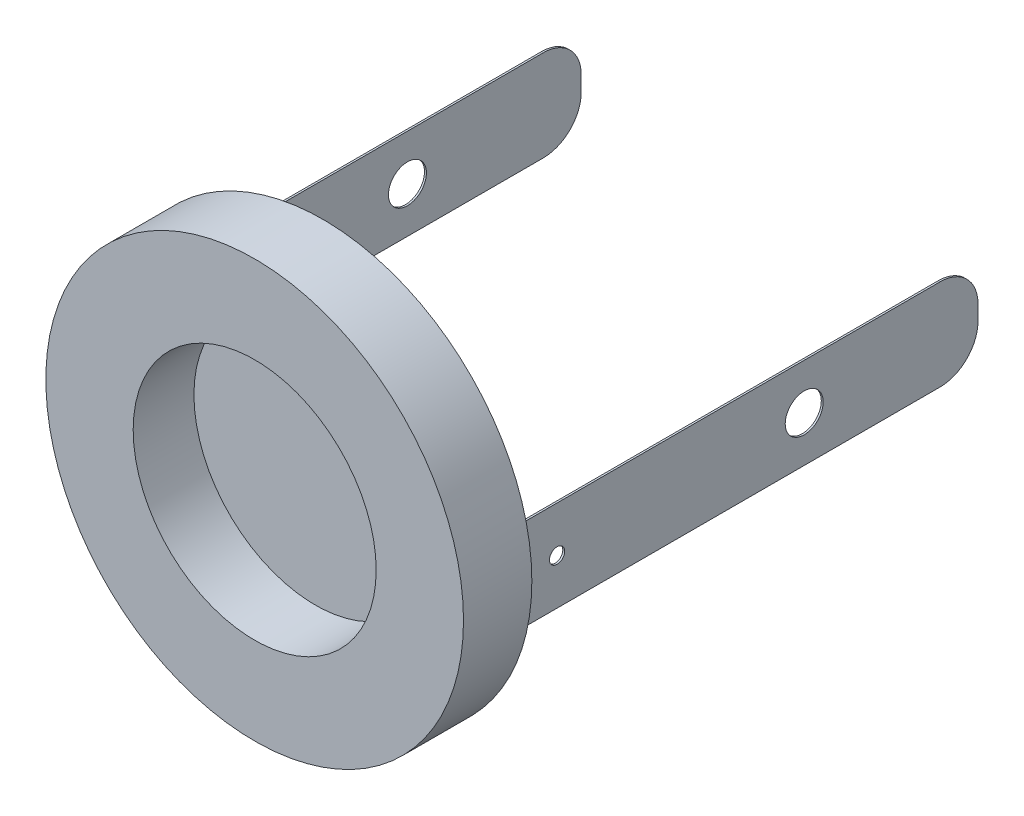
ISO-10303-21;
HEADER;
FILE_DESCRIPTION(('STEP AP214'),'2;1');
FILE_NAME('part.step','',(''),(''),'','','');
FILE_SCHEMA(('AUTOMOTIVE_DESIGN { 1 0 10303 214 1 1 1 1 }'));
ENDSEC;
DATA;
#1=APPLICATION_CONTEXT('core data for automotive mechanical design processes');
#2=APPLICATION_PROTOCOL_DEFINITION('international standard','automotive_design',2000,#1);
#3=PRODUCT_CONTEXT('',#1,'mechanical');
#4=PRODUCT('Part','Part','',(#3));
#5=PRODUCT_RELATED_PRODUCT_CATEGORY('part','',(#4));
#6=PRODUCT_DEFINITION_FORMATION('','',#4);
#7=PRODUCT_DEFINITION_CONTEXT('part definition',#1,'design');
#8=PRODUCT_DEFINITION('design','',#6,#7);
#9=PRODUCT_DEFINITION_SHAPE('','',#8);
#10=(LENGTH_UNIT() NAMED_UNIT(*) SI_UNIT(.MILLI.,.METRE.));
#11=(NAMED_UNIT(*) PLANE_ANGLE_UNIT() SI_UNIT($,.RADIAN.));
#12=(NAMED_UNIT(*) SI_UNIT($,.STERADIAN.) SOLID_ANGLE_UNIT());
#13=UNCERTAINTY_MEASURE_WITH_UNIT(LENGTH_MEASURE(1.E-05),#10,'distance_accuracy_value','');
#14=(GEOMETRIC_REPRESENTATION_CONTEXT(3) GLOBAL_UNCERTAINTY_ASSIGNED_CONTEXT((#13)) GLOBAL_UNIT_ASSIGNED_CONTEXT((#10,
#11,#12)) REPRESENTATION_CONTEXT('',''));
#15=CARTESIAN_POINT('',(0.,0.,0.));
#16=DIRECTION('',(0.,0.,1.));
#17=DIRECTION('',(1.,0.,0.));
#18=AXIS2_PLACEMENT_3D('',#15,#16,#17);
#19=CARTESIAN_POINT('',(0.,0.,0.));
#20=DIRECTION('',(0.,0.,1.));
#21=DIRECTION('',(1.,0.,0.));
#22=AXIS2_PLACEMENT_3D('',#19,#20,#21);
#23=PLANE('',#22);
#24=DIRECTION('',(0.,-1.,0.));
#25=VECTOR('',#24,1.);
#26=CARTESIAN_POINT('',(-26.,-5.99999999999996,0.));
#27=LINE('',#26,#25);
#28=CARTESIAN_POINT('',(-26.,5.99999999999996,0.));
#29=VERTEX_POINT('',#28);
#30=CARTESIAN_POINT('',(-26.,-5.99999999999996,0.));
#31=VERTEX_POINT('',#30);
#32=EDGE_CURVE('E175',#29,#31,#27,.T.);
#33=ORIENTED_EDGE('',*,*,#32,.F.);
#34=DIRECTION('',(1.,-1.76694558583094E-13,0.));
#35=VECTOR('',#34,1.);
#36=CARTESIAN_POINT('',(-26.,5.99999999999996,0.));
#37=LINE('',#36,#35);
#38=CARTESIAN_POINT('',(-26.2503498069897,6.,0.));
#39=VERTEX_POINT('',#38);
#40=EDGE_CURVE('E181',#39,#29,#37,.T.);
#41=ORIENTED_EDGE('',*,*,#40,.F.);
#42=DIRECTION('',(0.,1.,0.));
#43=VECTOR('',#42,1.);
#44=CARTESIAN_POINT('',(-26.2503498069897,-6.,0.));
#45=LINE('',#44,#43);
#46=CARTESIAN_POINT('',(-26.2503498069897,-6.,0.));
#47=VERTEX_POINT('',#46);
#48=EDGE_CURVE('E193',#47,#39,#45,.T.);
#49=ORIENTED_EDGE('',*,*,#48,.F.);
#50=DIRECTION('',(-1.,-1.76694558583094E-13,0.));
#51=VECTOR('',#50,1.);
#52=CARTESIAN_POINT('',(-26.,-5.99999999999996,0.));
#53=LINE('',#52,#51);
#54=EDGE_CURVE('E189',#31,#47,#53,.T.);
#55=ORIENTED_EDGE('',*,*,#54,.F.);
#56=EDGE_LOOP('',(#33,#41,#49,#55));
#57=FACE_BOUND('',#56,.T.);
#58=CARTESIAN_POINT('',(0.,0.,0.));
#59=DIRECTION('',(0.,0.,1.));
#60=DIRECTION('',(1.,0.,0.));
#61=AXIS2_PLACEMENT_3D('',#58,#59,#60);
#62=CIRCLE('',#61,27.5);
#63=CARTESIAN_POINT('',(27.5,0.,0.));
#64=VERTEX_POINT('',#63);
#65=EDGE_CURVE('E219',#64,#64,#62,.T.);
#66=ORIENTED_EDGE('',*,*,#65,.F.);
#67=EDGE_LOOP('',(#66));
#68=FACE_BOUND('',#67,.T.);
#69=DIRECTION('',(-1.,2.0094675289842E-13,0.));
#70=VECTOR('',#69,1.);
#71=CARTESIAN_POINT('',(26.,-5.99999999999995,0.));
#72=LINE('',#71,#70);
#73=CARTESIAN_POINT('',(26.2503498069897,-6.,0.));
#74=VERTEX_POINT('',#73);
#75=CARTESIAN_POINT('',(26.,-5.99999999999995,0.));
#76=VERTEX_POINT('',#75);
#77=EDGE_CURVE('E134',#74,#76,#72,.T.);
#78=ORIENTED_EDGE('',*,*,#77,.F.);
#79=DIRECTION('',(0.,-1.,0.));
#80=VECTOR('',#79,1.);
#81=CARTESIAN_POINT('',(26.2503498069897,-6.,0.));
#82=LINE('',#81,#80);
#83=CARTESIAN_POINT('',(26.2503498069897,6.,0.));
#84=VERTEX_POINT('',#83);
#85=EDGE_CURVE('E147',#84,#74,#82,.T.);
#86=ORIENTED_EDGE('',*,*,#85,.F.);
#87=DIRECTION('',(1.,2.0094675289842E-13,0.));
#88=VECTOR('',#87,1.);
#89=CARTESIAN_POINT('',(26.,5.99999999999995,0.));
#90=LINE('',#89,#88);
#91=CARTESIAN_POINT('',(26.,5.99999999999995,0.));
#92=VERTEX_POINT('',#91);
#93=EDGE_CURVE('E158',#92,#84,#90,.T.);
#94=ORIENTED_EDGE('',*,*,#93,.F.);
#95=DIRECTION('',(0.,1.,0.));
#96=VECTOR('',#95,1.);
#97=CARTESIAN_POINT('',(26.,-5.99999999999995,0.));
#98=LINE('',#97,#96);
#99=EDGE_CURVE('E150',#76,#92,#98,.T.);
#100=ORIENTED_EDGE('',*,*,#99,.F.);
#101=EDGE_LOOP('',(#78,#86,#94,#100));
#102=FACE_BOUND('',#101,.T.);
#103=ADVANCED_FACE('F41',(#57,#68,#102),#23,.F.);
#104=CARTESIAN_POINT('',(0.,0.,1.));
#105=DIRECTION('',(0.,0.,-1.));
#106=DIRECTION('',(-1.,0.,0.));
#107=AXIS2_PLACEMENT_3D('',#104,#105,#106);
#108=CYLINDRICAL_SURFACE('',#107,27.5);
#109=ORIENTED_EDGE('',*,*,#65,.T.);
#110=EDGE_LOOP('',(#109));
#111=FACE_BOUND('',#110,.T.);
#112=CARTESIAN_POINT('',(0.,0.,9.));
#113=DIRECTION('',(0.,0.,1.));
#114=DIRECTION('',(1.,0.,0.));
#115=AXIS2_PLACEMENT_3D('',#112,#113,#114);
#116=CIRCLE('',#115,27.5);
#117=CARTESIAN_POINT('',(27.5,0.,9.));
#118=VERTEX_POINT('',#117);
#119=EDGE_CURVE('E215',#118,#118,#116,.T.);
#120=ORIENTED_EDGE('',*,*,#119,.F.);
#121=EDGE_LOOP('',(#120));
#122=FACE_BOUND('',#121,.T.);
#123=ADVANCED_FACE('F336',(#111,#122),#108,.T.);
#124=CARTESIAN_POINT('',(0.,0.,9.));
#125=DIRECTION('',(0.,0.,1.));
#126=DIRECTION('',(1.,0.,0.));
#127=AXIS2_PLACEMENT_3D('',#124,#125,#126);
#128=PLANE('',#127);
#129=ORIENTED_EDGE('',*,*,#119,.T.);
#130=EDGE_LOOP('',(#129));
#131=FACE_BOUND('',#130,.T.);
#132=CARTESIAN_POINT('',(0.,0.,9.));
#133=DIRECTION('',(0.,0.,1.));
#134=DIRECTION('',(1.,0.,0.));
#135=AXIS2_PLACEMENT_3D('',#132,#133,#134);
#136=CIRCLE('',#135,16.);
#137=CARTESIAN_POINT('',(16.,0.,9.));
#138=VERTEX_POINT('',#137);
#139=EDGE_CURVE('E211',#138,#138,#136,.T.);
#140=ORIENTED_EDGE('',*,*,#139,.F.);
#141=EDGE_LOOP('',(#140));
#142=FACE_BOUND('',#141,.T.);
#143=ADVANCED_FACE('F342',(#131,#142),#128,.T.);
#144=CARTESIAN_POINT('',(0.,0.,9.));
#145=DIRECTION('',(0.,0.,-1.));
#146=DIRECTION('',(-1.,0.,0.));
#147=AXIS2_PLACEMENT_3D('',#144,#145,#146);
#148=CYLINDRICAL_SURFACE('',#147,16.);
#149=ORIENTED_EDGE('',*,*,#139,.T.);
#150=EDGE_LOOP('',(#149));
#151=FACE_BOUND('',#150,.T.);
#152=CARTESIAN_POINT('',(0.,0.,1.));
#153=DIRECTION('',(0.,0.,1.));
#154=DIRECTION('',(1.,0.,0.));
#155=AXIS2_PLACEMENT_3D('',#152,#153,#154);
#156=CIRCLE('',#155,16.);
#157=CARTESIAN_POINT('',(16.,0.,1.));
#158=VERTEX_POINT('',#157);
#159=EDGE_CURVE('E223',#158,#158,#156,.F.);
#160=ORIENTED_EDGE('',*,*,#159,.T.);
#161=EDGE_LOOP('',(#160));
#162=FACE_BOUND('',#161,.T.);
#163=ADVANCED_FACE('F509',(#151,#162),#148,.F.);
#164=CARTESIAN_POINT('',(0.,0.,1.));
#165=DIRECTION('',(0.,0.,1.));
#166=DIRECTION('',(1.,0.,0.));
#167=AXIS2_PLACEMENT_3D('',#164,#165,#166);
#168=PLANE('',#167);
#169=ORIENTED_EDGE('',*,*,#159,.F.);
#170=EDGE_LOOP('',(#169));
#171=FACE_BOUND('',#170,.T.);
#172=ADVANCED_FACE('F348',(#171),#168,.T.);
#173=CARTESIAN_POINT('',(-26.,-5.99999999999996,-60.));
#174=DIRECTION('',(-1.,0.,0.));
#175=DIRECTION('',(0.,0.,1.));
#176=AXIS2_PLACEMENT_3D('',#173,#174,#175);
#177=PLANE('',#176);
#178=CARTESIAN_POINT('',(-26.,0.,-37.1138525253459));
#179=DIRECTION('',(-1.,0.,0.));
#180=DIRECTION('',(0.,0.,1.));
#181=AXIS2_PLACEMENT_3D('',#178,#179,#180);
#182=CIRCLE('',#181,2.5);
#183=CARTESIAN_POINT('',(-26.,0.,-34.6138525253459));
#184=VERTEX_POINT('',#183);
#185=EDGE_CURVE('E152',#184,#184,#182,.T.);
#186=ORIENTED_EDGE('',*,*,#185,.T.);
#187=EDGE_LOOP('',(#186));
#188=FACE_BOUND('',#187,.T.);
#189=CARTESIAN_POINT('',(-26.,0.,-4.57317649649269));
#190=DIRECTION('',(-1.,0.,0.));
#191=DIRECTION('',(0.,0.,1.));
#192=AXIS2_PLACEMENT_3D('',#189,#190,#191);
#193=CIRCLE('',#192,0.999999999999998);
#194=CARTESIAN_POINT('',(-26.,0.,-3.57317649649269));
#195=VERTEX_POINT('',#194);
#196=EDGE_CURVE('E238',#195,#195,#193,.T.);
#197=ORIENTED_EDGE('',*,*,#196,.T.);
#198=EDGE_LOOP('',(#197));
#199=FACE_BOUND('',#198,.T.);
#200=DIRECTION('',(0.,-1.,0.));
#201=VECTOR('',#200,1.);
#202=CARTESIAN_POINT('',(-26.,-5.99999999999996,-60.));
#203=LINE('',#202,#201);
#204=CARTESIAN_POINT('',(-26.,0.999999999999955,-60.));
#205=VERTEX_POINT('',#204);
#206=CARTESIAN_POINT('',(-26.,-0.999999999999958,-60.));
#207=VERTEX_POINT('',#206);
#208=EDGE_CURVE('E176',#205,#207,#203,.T.);
#209=ORIENTED_EDGE('',*,*,#208,.F.);
#210=CARTESIAN_POINT('',(-26.,0.999999999999957,-55.));
#211=DIRECTION('',(-1.,0.,0.));
#212=DIRECTION('',(0.,0.,1.));
#213=AXIS2_PLACEMENT_3D('',#210,#211,#212);
#214=CIRCLE('',#213,5.);
#215=CARTESIAN_POINT('',(-26.,5.99999999999996,-55.));
#216=VERTEX_POINT('',#215);
#217=EDGE_CURVE('E249',#205,#216,#214,.F.);
#218=ORIENTED_EDGE('',*,*,#217,.T.);
#219=DIRECTION('',(0.,0.,1.));
#220=VECTOR('',#219,1.);
#221=CARTESIAN_POINT('',(-26.,5.99999999999996,-60.));
#222=LINE('',#221,#220);
#223=EDGE_CURVE('E185',#216,#29,#222,.T.);
#224=ORIENTED_EDGE('',*,*,#223,.T.);
#225=ORIENTED_EDGE('',*,*,#32,.T.);
#226=DIRECTION('',(0.,0.,1.));
#227=VECTOR('',#226,1.);
#228=CARTESIAN_POINT('',(-26.,-5.99999999999996,-60.));
#229=LINE('',#228,#227);
#230=CARTESIAN_POINT('',(-26.,-5.99999999999996,-55.));
#231=VERTEX_POINT('',#230);
#232=EDGE_CURVE('E208',#231,#31,#229,.T.);
#233=ORIENTED_EDGE('',*,*,#232,.F.);
#234=CARTESIAN_POINT('',(-26.,-0.999999999999957,-55.));
#235=DIRECTION('',(-1.,0.,0.));
#236=DIRECTION('',(0.,0.,1.));
#237=AXIS2_PLACEMENT_3D('',#234,#235,#236);
#238=CIRCLE('',#237,5.);
#239=EDGE_CURVE('E246',#231,#207,#238,.F.);
#240=ORIENTED_EDGE('',*,*,#239,.T.);
#241=EDGE_LOOP('',(#209,#218,#224,#225,#233,#240));
#242=FACE_BOUND('',#241,.T.);
#243=ADVANCED_FACE('F464',(#188,#199,#242),#177,.F.);
#244=CARTESIAN_POINT('',(-26.,-5.99999999999996,-60.));
#245=DIRECTION('',(-1.76694558583094E-13,1.,0.));
#246=DIRECTION('',(-1.,-1.76694558583094E-13,0.));
#247=AXIS2_PLACEMENT_3D('',#244,#245,#246);
#248=PLANE('',#247);
#249=DIRECTION('',(0.,0.,1.));
#250=VECTOR('',#249,1.);
#251=CARTESIAN_POINT('',(-26.2503498069897,-6.,-60.));
#252=LINE('',#251,#250);
#253=CARTESIAN_POINT('',(-26.2503498069897,-6.,-55.));
#254=VERTEX_POINT('',#253);
#255=EDGE_CURVE('E205',#254,#47,#252,.T.);
#256=ORIENTED_EDGE('',*,*,#255,.F.);
#257=DIRECTION('',(-1.,-1.76694558583094E-13,0.));
#258=VECTOR('',#257,1.);
#259=CARTESIAN_POINT('',(-26.,-5.99999999999996,-55.));
#260=LINE('',#259,#258);
#261=EDGE_CURVE('E261',#254,#231,#260,.F.);
#262=ORIENTED_EDGE('',*,*,#261,.T.);
#263=ORIENTED_EDGE('',*,*,#232,.T.);
#264=ORIENTED_EDGE('',*,*,#54,.T.);
#265=EDGE_LOOP('',(#256,#262,#263,#264));
#266=FACE_BOUND('',#265,.T.);
#267=ADVANCED_FACE('F454',(#266),#248,.F.);
#268=CARTESIAN_POINT('',(-26.2503498069897,-6.,-60.));
#269=DIRECTION('',(1.,0.,0.));
#270=DIRECTION('',(0.,0.,-1.));
#271=AXIS2_PLACEMENT_3D('',#268,#269,#270);
#272=PLANE('',#271);
#273=CARTESIAN_POINT('',(-26.2503498069897,0.,-37.1138525253459));
#274=DIRECTION('',(1.,0.,0.));
#275=DIRECTION('',(0.,0.,-1.));
#276=AXIS2_PLACEMENT_3D('',#273,#274,#275);
#277=CIRCLE('',#276,2.5);
#278=CARTESIAN_POINT('',(-26.2503498069897,0.,-39.6138525253459));
#279=VERTEX_POINT('',#278);
#280=EDGE_CURVE('E299',#279,#279,#277,.T.);
#281=ORIENTED_EDGE('',*,*,#280,.T.);
#282=EDGE_LOOP('',(#281));
#283=FACE_BOUND('',#282,.T.);
#284=CARTESIAN_POINT('',(-26.2503498069897,0.,-4.57317649649269));
#285=DIRECTION('',(1.,0.,0.));
#286=DIRECTION('',(0.,0.,-1.));
#287=AXIS2_PLACEMENT_3D('',#284,#285,#286);
#288=CIRCLE('',#287,0.999999999999998);
#289=CARTESIAN_POINT('',(-26.2503498069897,0.,-5.57317649649269));
#290=VERTEX_POINT('',#289);
#291=EDGE_CURVE('E309',#290,#290,#288,.T.);
#292=ORIENTED_EDGE('',*,*,#291,.T.);
#293=EDGE_LOOP('',(#292));
#294=FACE_BOUND('',#293,.T.);
#295=DIRECTION('',(0.,0.,1.));
#296=VECTOR('',#295,1.);
#297=CARTESIAN_POINT('',(-26.2503498069897,6.,-60.));
#298=LINE('',#297,#296);
#299=CARTESIAN_POINT('',(-26.2503498069897,6.,-55.));
#300=VERTEX_POINT('',#299);
#301=EDGE_CURVE('E202',#300,#39,#298,.T.);
#302=ORIENTED_EDGE('',*,*,#301,.F.);
#303=CARTESIAN_POINT('',(-26.2503498069897,1.,-55.));
#304=DIRECTION('',(1.,0.,0.));
#305=DIRECTION('',(0.,0.,-1.));
#306=AXIS2_PLACEMENT_3D('',#303,#304,#305);
#307=CIRCLE('',#306,5.);
#308=CARTESIAN_POINT('',(-26.2503498069897,1.,-60.));
#309=VERTEX_POINT('',#308);
#310=EDGE_CURVE('E258',#300,#309,#307,.F.);
#311=ORIENTED_EDGE('',*,*,#310,.T.);
#312=DIRECTION('',(0.,1.,0.));
#313=VECTOR('',#312,1.);
#314=CARTESIAN_POINT('',(-26.2503498069897,-6.,-60.));
#315=LINE('',#314,#313);
#316=CARTESIAN_POINT('',(-26.2503498069897,-1.,-60.));
#317=VERTEX_POINT('',#316);
#318=EDGE_CURVE('E180',#317,#309,#315,.T.);
#319=ORIENTED_EDGE('',*,*,#318,.F.);
#320=CARTESIAN_POINT('',(-26.2503498069897,-1.,-55.));
#321=DIRECTION('',(1.,0.,0.));
#322=DIRECTION('',(0.,0.,-1.));
#323=AXIS2_PLACEMENT_3D('',#320,#321,#322);
#324=CIRCLE('',#323,5.);
#325=EDGE_CURVE('E255',#317,#254,#324,.F.);
#326=ORIENTED_EDGE('',*,*,#325,.T.);
#327=ORIENTED_EDGE('',*,*,#255,.T.);
#328=ORIENTED_EDGE('',*,*,#48,.T.);
#329=EDGE_LOOP('',(#302,#311,#319,#326,#327,#328));
#330=FACE_BOUND('',#329,.T.);
#331=ADVANCED_FACE('F444',(#283,#294,#330),#272,.F.);
#332=CARTESIAN_POINT('',(-26.,5.99999999999996,-60.));
#333=DIRECTION('',(-1.76694558583094E-13,-1.,0.));
#334=DIRECTION('',(1.,-1.76694558583094E-13,0.));
#335=AXIS2_PLACEMENT_3D('',#332,#333,#334);
#336=PLANE('',#335);
#337=ORIENTED_EDGE('',*,*,#223,.F.);
#338=DIRECTION('',(1.,-1.76694558583094E-13,0.));
#339=VECTOR('',#338,1.);
#340=CARTESIAN_POINT('',(-26.,5.99999999999996,-55.));
#341=LINE('',#340,#339);
#342=EDGE_CURVE('E252',#216,#300,#341,.F.);
#343=ORIENTED_EDGE('',*,*,#342,.T.);
#344=ORIENTED_EDGE('',*,*,#301,.T.);
#345=ORIENTED_EDGE('',*,*,#40,.T.);
#346=EDGE_LOOP('',(#337,#343,#344,#345));
#347=FACE_BOUND('',#346,.T.);
#348=ADVANCED_FACE('F434',(#347),#336,.F.);
#349=CARTESIAN_POINT('',(0.,0.,-60.));
#350=DIRECTION('',(0.,0.,1.));
#351=DIRECTION('',(1.,0.,0.));
#352=AXIS2_PLACEMENT_3D('',#349,#350,#351);
#353=PLANE('',#352);
#354=ORIENTED_EDGE('',*,*,#318,.T.);
#355=DIRECTION('',(1.,-1.76694558583094E-13,0.));
#356=VECTOR('',#355,1.);
#357=CARTESIAN_POINT('',(1.76694558582274E-13,0.999999999995363,-60.));
#358=LINE('',#357,#356);
#359=EDGE_CURVE('E242',#309,#205,#358,.T.);
#360=ORIENTED_EDGE('',*,*,#359,.T.);
#361=ORIENTED_EDGE('',*,*,#208,.T.);
#362=DIRECTION('',(-1.,-1.76694558583094E-13,0.));
#363=VECTOR('',#362,1.);
#364=CARTESIAN_POINT('',(1.76694558582274E-13,-0.999999999995363,-60.));
#365=LINE('',#364,#363);
#366=EDGE_CURVE('E227',#207,#317,#365,.T.);
#367=ORIENTED_EDGE('',*,*,#366,.T.);
#368=EDGE_LOOP('',(#354,#360,#361,#367));
#369=FACE_BOUND('',#368,.T.);
#370=ADVANCED_FACE('F425',(#369),#353,.F.);
#371=CARTESIAN_POINT('',(26.,-5.99999999999995,-60.));
#372=DIRECTION('',(2.0094675289842E-13,1.,0.));
#373=DIRECTION('',(-1.,2.0094675289842E-13,0.));
#374=AXIS2_PLACEMENT_3D('',#371,#372,#373);
#375=PLANE('',#374);
#376=DIRECTION('',(0.,0.,1.));
#377=VECTOR('',#376,1.);
#378=CARTESIAN_POINT('',(26.,-5.99999999999995,-60.));
#379=LINE('',#378,#377);
#380=CARTESIAN_POINT('',(26.,-5.99999999999995,-55.));
#381=VERTEX_POINT('',#380);
#382=EDGE_CURVE('E172',#381,#76,#379,.T.);
#383=ORIENTED_EDGE('',*,*,#382,.F.);
#384=DIRECTION('',(-1.,2.0094675289842E-13,0.));
#385=VECTOR('',#384,1.);
#386=CARTESIAN_POINT('',(26.,-5.99999999999995,-55.));
#387=LINE('',#386,#385);
#388=CARTESIAN_POINT('',(26.2503498069897,-6.,-55.));
#389=VERTEX_POINT('',#388);
#390=EDGE_CURVE('E11',#381,#389,#387,.F.);
#391=ORIENTED_EDGE('',*,*,#390,.T.);
#392=DIRECTION('',(0.,0.,1.));
#393=VECTOR('',#392,1.);
#394=CARTESIAN_POINT('',(26.2503498069897,-6.,-60.));
#395=LINE('',#394,#393);
#396=EDGE_CURVE('E131',#389,#74,#395,.T.);
#397=ORIENTED_EDGE('',*,*,#396,.T.);
#398=ORIENTED_EDGE('',*,*,#77,.T.);
#399=EDGE_LOOP('',(#383,#391,#397,#398));
#400=FACE_BOUND('',#399,.T.);
#401=ADVANCED_FACE('F133',(#400),#375,.F.);
#402=CARTESIAN_POINT('',(26.,-5.99999999999995,-60.));
#403=DIRECTION('',(1.,0.,0.));
#404=DIRECTION('',(0.,0.,-1.));
#405=AXIS2_PLACEMENT_3D('',#402,#403,#404);
#406=PLANE('',#405);
#407=CARTESIAN_POINT('',(26.,0.,-37.1138525253459));
#408=DIRECTION('',(1.,0.,0.));
#409=DIRECTION('',(0.,0.,-1.));
#410=AXIS2_PLACEMENT_3D('',#407,#408,#409);
#411=CIRCLE('',#410,2.5);
#412=CARTESIAN_POINT('',(26.,0.,-39.6138525253459));
#413=VERTEX_POINT('',#412);
#414=EDGE_CURVE('E237',#413,#413,#411,.T.);
#415=ORIENTED_EDGE('',*,*,#414,.T.);
#416=EDGE_LOOP('',(#415));
#417=FACE_BOUND('',#416,.T.);
#418=CARTESIAN_POINT('',(26.,0.,-4.57317649649269));
#419=DIRECTION('',(1.,0.,0.));
#420=DIRECTION('',(0.,0.,-1.));
#421=AXIS2_PLACEMENT_3D('',#418,#419,#420);
#422=CIRCLE('',#421,0.999999999999998);
#423=CARTESIAN_POINT('',(26.,0.,-5.57317649649269));
#424=VERTEX_POINT('',#423);
#425=EDGE_CURVE('E232',#424,#424,#422,.T.);
#426=ORIENTED_EDGE('',*,*,#425,.T.);
#427=EDGE_LOOP('',(#426));
#428=FACE_BOUND('',#427,.T.);
#429=DIRECTION('',(0.,0.,1.));
#430=VECTOR('',#429,1.);
#431=CARTESIAN_POINT('',(26.,5.99999999999995,-60.));
#432=LINE('',#431,#430);
#433=CARTESIAN_POINT('',(26.,5.99999999999995,-55.));
#434=VERTEX_POINT('',#433);
#435=EDGE_CURVE('E169',#434,#92,#432,.T.);
#436=ORIENTED_EDGE('',*,*,#435,.F.);
#437=CARTESIAN_POINT('',(26.,0.999999999999951,-55.));
#438=DIRECTION('',(1.,0.,0.));
#439=DIRECTION('',(0.,0.,-1.));
#440=AXIS2_PLACEMENT_3D('',#437,#438,#439);
#441=CIRCLE('',#440,5.);
#442=CARTESIAN_POINT('',(26.,0.999999999999949,-60.));
#443=VERTEX_POINT('',#442);
#444=EDGE_CURVE('E50',#434,#443,#441,.F.);
#445=ORIENTED_EDGE('',*,*,#444,.T.);
#446=DIRECTION('',(0.,1.,0.));
#447=VECTOR('',#446,1.);
#448=CARTESIAN_POINT('',(26.,-5.99999999999995,-60.));
#449=LINE('',#448,#447);
#450=CARTESIAN_POINT('',(26.,-0.999999999999952,-60.));
#451=VERTEX_POINT('',#450);
#452=EDGE_CURVE('E157',#451,#443,#449,.T.);
#453=ORIENTED_EDGE('',*,*,#452,.F.);
#454=CARTESIAN_POINT('',(26.,-0.999999999999951,-55.));
#455=DIRECTION('',(1.,0.,0.));
#456=DIRECTION('',(0.,0.,-1.));
#457=AXIS2_PLACEMENT_3D('',#454,#455,#456);
#458=CIRCLE('',#457,5.);
#459=EDGE_CURVE('E57',#451,#381,#458,.F.);
#460=ORIENTED_EDGE('',*,*,#459,.T.);
#461=ORIENTED_EDGE('',*,*,#382,.T.);
#462=ORIENTED_EDGE('',*,*,#99,.T.);
#463=EDGE_LOOP('',(#436,#445,#453,#460,#461,#462));
#464=FACE_BOUND('',#463,.T.);
#465=ADVANCED_FACE('F283',(#417,#428,#464),#406,.F.);
#466=CARTESIAN_POINT('',(26.,5.99999999999995,-60.));
#467=DIRECTION('',(2.0094675289842E-13,-1.,0.));
#468=DIRECTION('',(1.,2.0094675289842E-13,0.));
#469=AXIS2_PLACEMENT_3D('',#466,#467,#468);
#470=PLANE('',#469);
#471=DIRECTION('',(0.,0.,1.));
#472=VECTOR('',#471,1.);
#473=CARTESIAN_POINT('',(26.2503498069897,6.,-60.));
#474=LINE('',#473,#472);
#475=CARTESIAN_POINT('',(26.2503498069897,6.,-55.));
#476=VERTEX_POINT('',#475);
#477=EDGE_CURVE('E140',#476,#84,#474,.T.);
#478=ORIENTED_EDGE('',*,*,#477,.F.);
#479=DIRECTION('',(1.,2.0094675289842E-13,0.));
#480=VECTOR('',#479,1.);
#481=CARTESIAN_POINT('',(26.,5.99999999999995,-55.));
#482=LINE('',#481,#480);
#483=EDGE_CURVE('E65',#476,#434,#482,.F.);
#484=ORIENTED_EDGE('',*,*,#483,.T.);
#485=ORIENTED_EDGE('',*,*,#435,.T.);
#486=ORIENTED_EDGE('',*,*,#93,.T.);
#487=EDGE_LOOP('',(#478,#484,#485,#486));
#488=FACE_BOUND('',#487,.T.);
#489=ADVANCED_FACE('F291',(#488),#470,.F.);
#490=CARTESIAN_POINT('',(26.2503498069897,-6.,-60.));
#491=DIRECTION('',(-1.,0.,0.));
#492=DIRECTION('',(0.,0.,1.));
#493=AXIS2_PLACEMENT_3D('',#490,#491,#492);
#494=PLANE('',#493);
#495=CARTESIAN_POINT('',(26.2503498069897,0.,-37.1138525253459));
#496=DIRECTION('',(-1.,0.,0.));
#497=DIRECTION('',(0.,0.,1.));
#498=AXIS2_PLACEMENT_3D('',#495,#496,#497);
#499=CIRCLE('',#498,2.5);
#500=CARTESIAN_POINT('',(26.2503498069897,0.,-34.6138525253459));
#501=VERTEX_POINT('',#500);
#502=EDGE_CURVE('E233',#501,#501,#499,.T.);
#503=ORIENTED_EDGE('',*,*,#502,.T.);
#504=EDGE_LOOP('',(#503));
#505=FACE_BOUND('',#504,.T.);
#506=CARTESIAN_POINT('',(26.2503498069897,0.,-4.57317649649269));
#507=DIRECTION('',(-1.,0.,0.));
#508=DIRECTION('',(0.,0.,1.));
#509=AXIS2_PLACEMENT_3D('',#506,#507,#508);
#510=CIRCLE('',#509,0.999999999999998);
#511=CARTESIAN_POINT('',(26.2503498069897,0.,-3.57317649649269));
#512=VERTEX_POINT('',#511);
#513=EDGE_CURVE('E228',#512,#512,#510,.T.);
#514=ORIENTED_EDGE('',*,*,#513,.T.);
#515=EDGE_LOOP('',(#514));
#516=FACE_BOUND('',#515,.T.);
#517=DIRECTION('',(0.,-1.,0.));
#518=VECTOR('',#517,1.);
#519=CARTESIAN_POINT('',(26.2503498069897,-6.,-60.));
#520=LINE('',#519,#518);
#521=CARTESIAN_POINT('',(26.2503498069897,1.,-60.));
#522=VERTEX_POINT('',#521);
#523=CARTESIAN_POINT('',(26.2503498069897,-1.,-60.));
#524=VERTEX_POINT('',#523);
#525=EDGE_CURVE('E141',#522,#524,#520,.T.);
#526=ORIENTED_EDGE('',*,*,#525,.F.);
#527=CARTESIAN_POINT('',(26.2503498069897,1.,-55.));
#528=DIRECTION('',(-1.,0.,0.));
#529=DIRECTION('',(0.,0.,1.));
#530=AXIS2_PLACEMENT_3D('',#527,#528,#529);
#531=CIRCLE('',#530,5.);
#532=EDGE_CURVE('E275',#522,#476,#531,.F.);
#533=ORIENTED_EDGE('',*,*,#532,.T.);
#534=ORIENTED_EDGE('',*,*,#477,.T.);
#535=ORIENTED_EDGE('',*,*,#85,.T.);
#536=ORIENTED_EDGE('',*,*,#396,.F.);
#537=CARTESIAN_POINT('',(26.2503498069897,-1.,-55.));
#538=DIRECTION('',(-1.,0.,0.));
#539=DIRECTION('',(0.,0.,1.));
#540=AXIS2_PLACEMENT_3D('',#537,#538,#539);
#541=CIRCLE('',#540,5.);
#542=EDGE_CURVE('E272',#389,#524,#541,.F.);
#543=ORIENTED_EDGE('',*,*,#542,.T.);
#544=EDGE_LOOP('',(#526,#533,#534,#535,#536,#543));
#545=FACE_BOUND('',#544,.T.);
#546=ADVANCED_FACE('F155',(#505,#516,#545),#494,.F.);
#547=CARTESIAN_POINT('',(0.,0.,-60.));
#548=DIRECTION('',(0.,0.,1.));
#549=DIRECTION('',(1.,0.,0.));
#550=AXIS2_PLACEMENT_3D('',#547,#548,#549);
#551=PLANE('',#550);
#552=ORIENTED_EDGE('',*,*,#452,.T.);
#553=DIRECTION('',(1.,2.0094675289842E-13,0.));
#554=VECTOR('',#553,1.);
#555=CARTESIAN_POINT('',(-2.00946752897361E-13,0.999999999994726,-60.));
#556=LINE('',#555,#554);
#557=EDGE_CURVE('E268',#443,#522,#556,.T.);
#558=ORIENTED_EDGE('',*,*,#557,.T.);
#559=ORIENTED_EDGE('',*,*,#525,.T.);
#560=DIRECTION('',(-1.,2.0094675289842E-13,0.));
#561=VECTOR('',#560,1.);
#562=CARTESIAN_POINT('',(-2.00946752897361E-13,-0.999999999994726,-60.));
#563=LINE('',#562,#561);
#564=EDGE_CURVE('E264',#524,#451,#563,.T.);
#565=ORIENTED_EDGE('',*,*,#564,.T.);
#566=EDGE_LOOP('',(#552,#558,#559,#565));
#567=FACE_BOUND('',#566,.T.);
#568=ADVANCED_FACE('F287',(#567),#551,.F.);
#569=CARTESIAN_POINT('',(-27.5,0.,-4.57317649649269));
#570=DIRECTION('',(1.,0.,0.));
#571=DIRECTION('',(0.,0.,-1.));
#572=AXIS2_PLACEMENT_3D('',#569,#570,#571);
#573=CYLINDRICAL_SURFACE('',#572,0.999999999999998);
#574=ORIENTED_EDGE('',*,*,#513,.F.);
#575=EDGE_LOOP('',(#574));
#576=FACE_BOUND('',#575,.T.);
#577=ORIENTED_EDGE('',*,*,#425,.F.);
#578=EDGE_LOOP('',(#577));
#579=FACE_BOUND('',#578,.T.);
#580=ADVANCED_FACE('F318',(#576,#579),#573,.F.);
#581=CARTESIAN_POINT('',(-27.5,0.,-37.1138525253459));
#582=DIRECTION('',(1.,0.,0.));
#583=DIRECTION('',(0.,0.,-1.));
#584=AXIS2_PLACEMENT_3D('',#581,#582,#583);
#585=CYLINDRICAL_SURFACE('',#584,2.5);
#586=ORIENTED_EDGE('',*,*,#502,.F.);
#587=EDGE_LOOP('',(#586));
#588=FACE_BOUND('',#587,.T.);
#589=ORIENTED_EDGE('',*,*,#414,.F.);
#590=EDGE_LOOP('',(#589));
#591=FACE_BOUND('',#590,.T.);
#592=ADVANCED_FACE('F320',(#588,#591),#585,.F.);
#593=ORIENTED_EDGE('',*,*,#291,.F.);
#594=EDGE_LOOP('',(#593));
#595=FACE_BOUND('',#594,.T.);
#596=ORIENTED_EDGE('',*,*,#196,.F.);
#597=EDGE_LOOP('',(#596));
#598=FACE_BOUND('',#597,.T.);
#599=ADVANCED_FACE('F323',(#595,#598),#573,.F.);
#600=ORIENTED_EDGE('',*,*,#280,.F.);
#601=EDGE_LOOP('',(#600));
#602=FACE_BOUND('',#601,.T.);
#603=ORIENTED_EDGE('',*,*,#185,.F.);
#604=EDGE_LOOP('',(#603));
#605=FACE_BOUND('',#604,.T.);
#606=ADVANCED_FACE('F330',(#602,#605),#585,.F.);
#607=CARTESIAN_POINT('',(1.76694558582274E-13,0.999999999995363,-55.));
#608=DIRECTION('',(1.,-1.76694558583094E-13,0.));
#609=DIRECTION('',(1.76694558583094E-13,1.,0.));
#610=AXIS2_PLACEMENT_3D('',#607,#608,#609);
#611=CYLINDRICAL_SURFACE('',#610,5.);
#612=ORIENTED_EDGE('',*,*,#310,.F.);
#613=ORIENTED_EDGE('',*,*,#342,.F.);
#614=ORIENTED_EDGE('',*,*,#217,.F.);
#615=ORIENTED_EDGE('',*,*,#359,.F.);
#616=EDGE_LOOP('',(#612,#613,#614,#615));
#617=FACE_BOUND('',#616,.T.);
#618=ADVANCED_FACE('F351',(#617),#611,.T.);
#619=CARTESIAN_POINT('',(1.76694558582274E-13,-0.999999999995363,-55.));
#620=DIRECTION('',(-1.,-1.76694558583094E-13,0.));
#621=DIRECTION('',(1.76694558583094E-13,-1.,0.));
#622=AXIS2_PLACEMENT_3D('',#619,#620,#621);
#623=CYLINDRICAL_SURFACE('',#622,5.);
#624=ORIENTED_EDGE('',*,*,#239,.F.);
#625=ORIENTED_EDGE('',*,*,#261,.F.);
#626=ORIENTED_EDGE('',*,*,#325,.F.);
#627=ORIENTED_EDGE('',*,*,#366,.F.);
#628=EDGE_LOOP('',(#624,#625,#626,#627));
#629=FACE_BOUND('',#628,.T.);
#630=ADVANCED_FACE('F354',(#629),#623,.T.);
#631=CARTESIAN_POINT('',(-2.00946752897361E-13,0.999999999994726,-55.));
#632=DIRECTION('',(1.,2.0094675289842E-13,0.));
#633=DIRECTION('',(-2.0094675289842E-13,1.,0.));
#634=AXIS2_PLACEMENT_3D('',#631,#632,#633);
#635=CYLINDRICAL_SURFACE('',#634,5.);
#636=ORIENTED_EDGE('',*,*,#444,.F.);
#637=ORIENTED_EDGE('',*,*,#483,.F.);
#638=ORIENTED_EDGE('',*,*,#532,.F.);
#639=ORIENTED_EDGE('',*,*,#557,.F.);
#640=EDGE_LOOP('',(#636,#637,#638,#639));
#641=FACE_BOUND('',#640,.T.);
#642=ADVANCED_FACE('F290',(#641),#635,.T.);
#643=CARTESIAN_POINT('',(-2.00946752897361E-13,-0.999999999994726,-55.));
#644=DIRECTION('',(-1.,2.0094675289842E-13,0.));
#645=DIRECTION('',(-2.0094675289842E-13,-1.,0.));
#646=AXIS2_PLACEMENT_3D('',#643,#644,#645);
#647=CYLINDRICAL_SURFACE('',#646,5.);
#648=ORIENTED_EDGE('',*,*,#542,.F.);
#649=ORIENTED_EDGE('',*,*,#390,.F.);
#650=ORIENTED_EDGE('',*,*,#459,.F.);
#651=ORIENTED_EDGE('',*,*,#564,.F.);
#652=EDGE_LOOP('',(#648,#649,#650,#651));
#653=FACE_BOUND('',#652,.T.);
#654=ADVANCED_FACE('F43',(#653),#647,.T.);
#655=CLOSED_SHELL('',(#103,#123,#143,#163,#172,#243,#267,#331,#348,#370,#401,#465,#489,#546,
#568,#580,#592,#599,#606,#618,#630,#642,#654));
#656=MANIFOLD_SOLID_BREP('B2',#655);
#657=ADVANCED_BREP_SHAPE_REPRESENTATION('',(#18,#656),#14);
#658=SHAPE_DEFINITION_REPRESENTATION(#9,#657);
ENDSEC;
END-ISO-10303-21;
